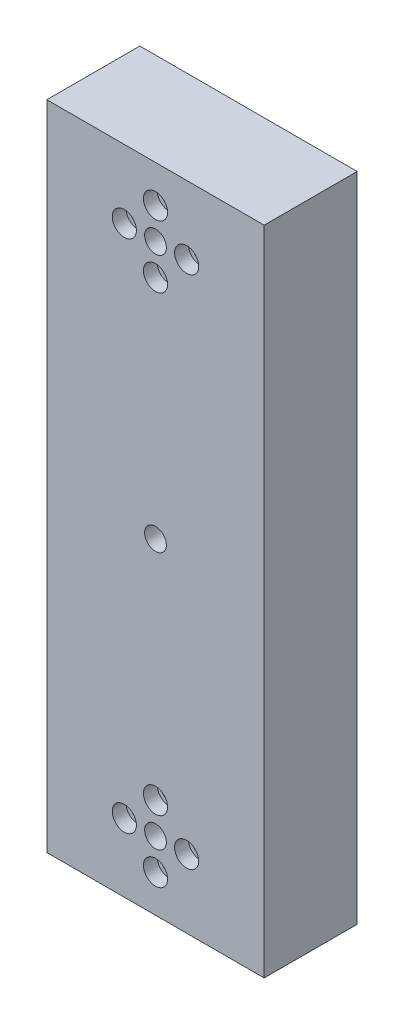
ISO-10303-21;
HEADER;
FILE_DESCRIPTION(('STEP AP214'),'2;1');
FILE_NAME('part.step','',(''),(''),'','','');
FILE_SCHEMA(('AUTOMOTIVE_DESIGN { 1 0 10303 214 1 1 1 1 }'));
ENDSEC;
DATA;
#1=APPLICATION_CONTEXT('core data for automotive mechanical design processes');
#2=APPLICATION_PROTOCOL_DEFINITION('international standard','automotive_design',2000,#1);
#3=PRODUCT_CONTEXT('',#1,'mechanical');
#4=PRODUCT('Part','Part','',(#3));
#5=PRODUCT_RELATED_PRODUCT_CATEGORY('part','',(#4));
#6=PRODUCT_DEFINITION_FORMATION('','',#4);
#7=PRODUCT_DEFINITION_CONTEXT('part definition',#1,'design');
#8=PRODUCT_DEFINITION('design','',#6,#7);
#9=PRODUCT_DEFINITION_SHAPE('','',#8);
#10=(LENGTH_UNIT() NAMED_UNIT(*) SI_UNIT(.MILLI.,.METRE.));
#11=(NAMED_UNIT(*) PLANE_ANGLE_UNIT() SI_UNIT($,.RADIAN.));
#12=(NAMED_UNIT(*) SI_UNIT($,.STERADIAN.) SOLID_ANGLE_UNIT());
#13=UNCERTAINTY_MEASURE_WITH_UNIT(LENGTH_MEASURE(1.E-05),#10,'distance_accuracy_value','');
#14=(GEOMETRIC_REPRESENTATION_CONTEXT(3) GLOBAL_UNCERTAINTY_ASSIGNED_CONTEXT((#13)) GLOBAL_UNIT_ASSIGNED_CONTEXT((#10,
#11,#12)) REPRESENTATION_CONTEXT('',''));
#15=CARTESIAN_POINT('',(0.,0.,0.));
#16=DIRECTION('',(0.,0.,1.));
#17=DIRECTION('',(1.,0.,0.));
#18=AXIS2_PLACEMENT_3D('',#15,#16,#17);
#19=CARTESIAN_POINT('',(0.,0.,0.));
#20=DIRECTION('',(0.,0.,-1.));
#21=DIRECTION('',(-1.,0.,0.));
#22=AXIS2_PLACEMENT_3D('',#19,#20,#21);
#23=PLANE('',#22);
#24=CARTESIAN_POINT('',(14.351,-118.5,0.));
#25=DIRECTION('',(0.,0.,1.));
#26=DIRECTION('',(1.,0.,0.));
#27=AXIS2_PLACEMENT_3D('',#24,#25,#26);
#28=CIRCLE('',#27,5.55625);
#29=CARTESIAN_POINT('',(19.90725,-118.5,0.));
#30=VERTEX_POINT('',#29);
#31=EDGE_CURVE('E388',#30,#30,#28,.T.);
#32=ORIENTED_EDGE('',*,*,#31,.F.);
#33=EDGE_LOOP('',(#32));
#34=FACE_BOUND('',#33,.T.);
#35=CARTESIAN_POINT('',(0.,-132.851,0.));
#36=DIRECTION('',(0.,0.,1.));
#37=DIRECTION('',(1.,0.,0.));
#38=AXIS2_PLACEMENT_3D('',#35,#36,#37);
#39=CIRCLE('',#38,5.55625);
#40=CARTESIAN_POINT('',(5.55625,-132.851,0.));
#41=VERTEX_POINT('',#40);
#42=EDGE_CURVE('E403',#41,#41,#39,.T.);
#43=ORIENTED_EDGE('',*,*,#42,.F.);
#44=EDGE_LOOP('',(#43));
#45=FACE_BOUND('',#44,.T.);
#46=CARTESIAN_POINT('',(-14.351,-118.5,0.));
#47=DIRECTION('',(0.,0.,1.));
#48=DIRECTION('',(1.,0.,0.));
#49=AXIS2_PLACEMENT_3D('',#46,#47,#48);
#50=CIRCLE('',#49,5.55625);
#51=CARTESIAN_POINT('',(-8.79475,-118.5,0.));
#52=VERTEX_POINT('',#51);
#53=EDGE_CURVE('E423',#52,#52,#50,.T.);
#54=ORIENTED_EDGE('',*,*,#53,.F.);
#55=EDGE_LOOP('',(#54));
#56=FACE_BOUND('',#55,.T.);
#57=CARTESIAN_POINT('',(0.,-104.149,0.));
#58=DIRECTION('',(0.,0.,1.));
#59=DIRECTION('',(1.,0.,0.));
#60=AXIS2_PLACEMENT_3D('',#57,#58,#59);
#61=CIRCLE('',#60,5.55625);
#62=CARTESIAN_POINT('',(5.55625,-104.149,0.));
#63=VERTEX_POINT('',#62);
#64=EDGE_CURVE('E440',#63,#63,#61,.T.);
#65=ORIENTED_EDGE('',*,*,#64,.F.);
#66=EDGE_LOOP('',(#65));
#67=FACE_BOUND('',#66,.T.);
#68=CARTESIAN_POINT('',(1.15628617791685E-13,104.149,0.));
#69=DIRECTION('',(0.,0.,1.));
#70=DIRECTION('',(1.,0.,0.));
#71=AXIS2_PLACEMENT_3D('',#68,#69,#70);
#72=CIRCLE('',#71,5.55625);
#73=CARTESIAN_POINT('',(5.55625000000011,104.149,0.));
#74=VERTEX_POINT('',#73);
#75=EDGE_CURVE('E455',#74,#74,#72,.T.);
#76=ORIENTED_EDGE('',*,*,#75,.F.);
#77=EDGE_LOOP('',(#76));
#78=FACE_BOUND('',#77,.T.);
#79=CARTESIAN_POINT('',(14.3510000000001,118.5,0.));
#80=DIRECTION('',(0.,0.,1.));
#81=DIRECTION('',(1.,0.,0.));
#82=AXIS2_PLACEMENT_3D('',#79,#80,#81);
#83=CIRCLE('',#82,5.55625);
#84=CARTESIAN_POINT('',(19.9072500000001,118.5,0.));
#85=VERTEX_POINT('',#84);
#86=EDGE_CURVE('E466',#85,#85,#83,.T.);
#87=ORIENTED_EDGE('',*,*,#86,.F.);
#88=EDGE_LOOP('',(#87));
#89=FACE_BOUND('',#88,.T.);
#90=CARTESIAN_POINT('',(-14.3509999999999,118.5,0.));
#91=DIRECTION('',(0.,0.,1.));
#92=DIRECTION('',(1.,0.,0.));
#93=AXIS2_PLACEMENT_3D('',#90,#91,#92);
#94=CIRCLE('',#93,5.55625);
#95=CARTESIAN_POINT('',(-8.79474999999987,118.5,0.));
#96=VERTEX_POINT('',#95);
#97=EDGE_CURVE('E502',#96,#96,#94,.T.);
#98=ORIENTED_EDGE('',*,*,#97,.F.);
#99=EDGE_LOOP('',(#98));
#100=FACE_BOUND('',#99,.T.);
#101=CARTESIAN_POINT('',(0.,118.5,0.));
#102=DIRECTION('',(0.,0.,1.));
#103=DIRECTION('',(-1.,0.,0.));
#104=AXIS2_PLACEMENT_3D('',#101,#102,#103);
#105=CIRCLE('',#104,5.);
#106=CARTESIAN_POINT('',(-5.,118.5,0.));
#107=VERTEX_POINT('',#106);
#108=EDGE_CURVE('E520',#107,#107,#105,.T.);
#109=ORIENTED_EDGE('',*,*,#108,.F.);
#110=EDGE_LOOP('',(#109));
#111=FACE_BOUND('',#110,.T.);
#112=CARTESIAN_POINT('',(0.,-118.5,0.));
#113=DIRECTION('',(0.,0.,1.));
#114=DIRECTION('',(1.,0.,0.));
#115=AXIS2_PLACEMENT_3D('',#112,#113,#114);
#116=CIRCLE('',#115,5.);
#117=CARTESIAN_POINT('',(5.,-118.5,0.));
#118=VERTEX_POINT('',#117);
#119=EDGE_CURVE('E524',#118,#118,#116,.T.);
#120=ORIENTED_EDGE('',*,*,#119,.F.);
#121=EDGE_LOOP('',(#120));
#122=FACE_BOUND('',#121,.T.);
#123=CARTESIAN_POINT('',(0.,0.,0.));
#124=DIRECTION('',(0.,0.,1.));
#125=DIRECTION('',(1.,0.,0.));
#126=AXIS2_PLACEMENT_3D('',#123,#124,#125);
#127=CIRCLE('',#126,5.);
#128=CARTESIAN_POINT('',(5.,0.,0.));
#129=VERTEX_POINT('',#128);
#130=EDGE_CURVE('E529',#129,#129,#127,.T.);
#131=ORIENTED_EDGE('',*,*,#130,.F.);
#132=EDGE_LOOP('',(#131));
#133=FACE_BOUND('',#132,.T.);
#134=DIRECTION('',(-1.,0.,0.));
#135=VECTOR('',#134,1.);
#136=CARTESIAN_POINT('',(50.,150.,0.));
#137=LINE('',#136,#135);
#138=CARTESIAN_POINT('',(50.,150.,0.));
#139=VERTEX_POINT('',#138);
#140=CARTESIAN_POINT('',(-50.,150.,0.));
#141=VERTEX_POINT('',#140);
#142=EDGE_CURVE('E231',#139,#141,#137,.T.);
#143=ORIENTED_EDGE('',*,*,#142,.T.);
#144=DIRECTION('',(0.,-1.,0.));
#145=VECTOR('',#144,1.);
#146=CARTESIAN_POINT('',(-50.,-150.,0.));
#147=LINE('',#146,#145);
#148=CARTESIAN_POINT('',(-50.,-150.,0.));
#149=VERTEX_POINT('',#148);
#150=EDGE_CURVE('E236',#141,#149,#147,.T.);
#151=ORIENTED_EDGE('',*,*,#150,.T.);
#152=DIRECTION('',(1.,0.,0.));
#153=VECTOR('',#152,1.);
#154=CARTESIAN_POINT('',(50.,-150.,0.));
#155=LINE('',#154,#153);
#156=CARTESIAN_POINT('',(50.,-150.,0.));
#157=VERTEX_POINT('',#156);
#158=EDGE_CURVE('E213',#149,#157,#155,.T.);
#159=ORIENTED_EDGE('',*,*,#158,.T.);
#160=DIRECTION('',(0.,1.,0.));
#161=VECTOR('',#160,1.);
#162=CARTESIAN_POINT('',(50.,-150.,0.));
#163=LINE('',#162,#161);
#164=EDGE_CURVE('E229',#157,#139,#163,.T.);
#165=ORIENTED_EDGE('',*,*,#164,.T.);
#166=EDGE_LOOP('',(#143,#151,#159,#165));
#167=FACE_BOUND('',#166,.T.);
#168=CARTESIAN_POINT('',(1.47494239044477E-13,132.851,0.));
#169=DIRECTION('',(0.,0.,1.));
#170=DIRECTION('',(1.,0.,0.));
#171=AXIS2_PLACEMENT_3D('',#168,#169,#170);
#172=CIRCLE('',#171,5.55625);
#173=CARTESIAN_POINT('',(5.55625000000015,132.851,0.));
#174=VERTEX_POINT('',#173);
#175=EDGE_CURVE('E484',#174,#174,#172,.T.);
#176=ORIENTED_EDGE('',*,*,#175,.F.);
#177=EDGE_LOOP('',(#176));
#178=FACE_BOUND('',#177,.T.);
#179=ADVANCED_FACE('F161',(#34,#45,#56,#67,#78,#89,#100,#111,#122,#133,#167,#178),#23,.F.);
#180=CARTESIAN_POINT('',(50.,150.,-42.8));
#181=DIRECTION('',(0.,1.,0.));
#182=DIRECTION('',(0.,0.,1.));
#183=AXIS2_PLACEMENT_3D('',#180,#181,#182);
#184=PLANE('',#183);
#185=ORIENTED_EDGE('',*,*,#142,.F.);
#186=DIRECTION('',(0.,0.,1.));
#187=VECTOR('',#186,1.);
#188=CARTESIAN_POINT('',(50.,150.,-42.8));
#189=LINE('',#188,#187);
#190=CARTESIAN_POINT('',(50.,150.,-42.8));
#191=VERTEX_POINT('',#190);
#192=EDGE_CURVE('E12',#191,#139,#189,.T.);
#193=ORIENTED_EDGE('',*,*,#192,.F.);
#194=DIRECTION('',(-1.,0.,0.));
#195=VECTOR('',#194,1.);
#196=CARTESIAN_POINT('',(50.,150.,-42.8));
#197=LINE('',#196,#195);
#198=CARTESIAN_POINT('',(-50.,150.,-42.8));
#199=VERTEX_POINT('',#198);
#200=EDGE_CURVE('E221',#191,#199,#197,.T.);
#201=ORIENTED_EDGE('',*,*,#200,.T.);
#202=DIRECTION('',(0.,0.,1.));
#203=VECTOR('',#202,1.);
#204=CARTESIAN_POINT('',(-50.,150.,-42.8));
#205=LINE('',#204,#203);
#206=EDGE_CURVE('E164',#199,#141,#205,.T.);
#207=ORIENTED_EDGE('',*,*,#206,.T.);
#208=EDGE_LOOP('',(#185,#193,#201,#207));
#209=FACE_BOUND('',#208,.T.);
#210=ADVANCED_FACE('F162',(#209),#184,.T.);
#211=CARTESIAN_POINT('',(50.,-150.,-42.8));
#212=DIRECTION('',(1.,0.,0.));
#213=DIRECTION('',(0.,0.,-1.));
#214=AXIS2_PLACEMENT_3D('',#211,#212,#213);
#215=PLANE('',#214);
#216=ORIENTED_EDGE('',*,*,#164,.F.);
#217=DIRECTION('',(0.,0.,1.));
#218=VECTOR('',#217,1.);
#219=CARTESIAN_POINT('',(50.,-150.,-42.8));
#220=LINE('',#219,#218);
#221=CARTESIAN_POINT('',(50.,-150.,-42.8));
#222=VERTEX_POINT('',#221);
#223=EDGE_CURVE('E175',#222,#157,#220,.T.);
#224=ORIENTED_EDGE('',*,*,#223,.F.);
#225=DIRECTION('',(0.,1.,0.));
#226=VECTOR('',#225,1.);
#227=CARTESIAN_POINT('',(50.,-150.,-42.8));
#228=LINE('',#227,#226);
#229=EDGE_CURVE('E218',#222,#191,#228,.T.);
#230=ORIENTED_EDGE('',*,*,#229,.T.);
#231=ORIENTED_EDGE('',*,*,#192,.T.);
#232=EDGE_LOOP('',(#216,#224,#230,#231));
#233=FACE_BOUND('',#232,.T.);
#234=ADVANCED_FACE('F260',(#233),#215,.T.);
#235=CARTESIAN_POINT('',(50.,-150.,-42.8));
#236=DIRECTION('',(0.,-1.,0.));
#237=DIRECTION('',(0.,0.,-1.));
#238=AXIS2_PLACEMENT_3D('',#235,#236,#237);
#239=PLANE('',#238);
#240=ORIENTED_EDGE('',*,*,#158,.F.);
#241=DIRECTION('',(0.,0.,1.));
#242=VECTOR('',#241,1.);
#243=CARTESIAN_POINT('',(-50.,-150.,-42.8));
#244=LINE('',#243,#242);
#245=CARTESIAN_POINT('',(-50.,-150.,-42.8));
#246=VERTEX_POINT('',#245);
#247=EDGE_CURVE('E208',#246,#149,#244,.T.);
#248=ORIENTED_EDGE('',*,*,#247,.F.);
#249=DIRECTION('',(1.,0.,0.));
#250=VECTOR('',#249,1.);
#251=CARTESIAN_POINT('',(50.,-150.,-42.8));
#252=LINE('',#251,#250);
#253=EDGE_CURVE('E211',#246,#222,#252,.T.);
#254=ORIENTED_EDGE('',*,*,#253,.T.);
#255=ORIENTED_EDGE('',*,*,#223,.T.);
#256=EDGE_LOOP('',(#240,#248,#254,#255));
#257=FACE_BOUND('',#256,.T.);
#258=ADVANCED_FACE('F209',(#257),#239,.T.);
#259=CARTESIAN_POINT('',(-50.,-150.,-42.8));
#260=DIRECTION('',(-1.,0.,0.));
#261=DIRECTION('',(0.,0.,1.));
#262=AXIS2_PLACEMENT_3D('',#259,#260,#261);
#263=PLANE('',#262);
#264=ORIENTED_EDGE('',*,*,#150,.F.);
#265=ORIENTED_EDGE('',*,*,#206,.F.);
#266=DIRECTION('',(0.,-1.,0.));
#267=VECTOR('',#266,1.);
#268=CARTESIAN_POINT('',(-50.,-150.,-42.8));
#269=LINE('',#268,#267);
#270=EDGE_CURVE('E217',#199,#246,#269,.T.);
#271=ORIENTED_EDGE('',*,*,#270,.T.);
#272=ORIENTED_EDGE('',*,*,#247,.T.);
#273=EDGE_LOOP('',(#264,#265,#271,#272));
#274=FACE_BOUND('',#273,.T.);
#275=ADVANCED_FACE('F225',(#274),#263,.T.);
#276=CARTESIAN_POINT('',(0.,0.,-42.8));
#277=DIRECTION('',(0.,0.,-1.));
#278=DIRECTION('',(-1.,0.,0.));
#279=AXIS2_PLACEMENT_3D('',#276,#277,#278);
#280=PLANE('',#279);
#281=CARTESIAN_POINT('',(14.351,-118.5,-42.8));
#282=DIRECTION('',(0.,0.,1.));
#283=DIRECTION('',(1.,0.,0.));
#284=AXIS2_PLACEMENT_3D('',#281,#282,#283);
#285=CIRCLE('',#284,3.56869999999999);
#286=CARTESIAN_POINT('',(17.9197,-118.5,-42.8));
#287=VERTEX_POINT('',#286);
#288=EDGE_CURVE('E402',#287,#287,#285,.T.);
#289=ORIENTED_EDGE('',*,*,#288,.T.);
#290=EDGE_LOOP('',(#289));
#291=FACE_BOUND('',#290,.T.);
#292=CARTESIAN_POINT('',(0.,-132.851,-42.8));
#293=DIRECTION('',(0.,0.,1.));
#294=DIRECTION('',(1.,0.,0.));
#295=AXIS2_PLACEMENT_3D('',#292,#293,#294);
#296=CIRCLE('',#295,3.56869999999999);
#297=CARTESIAN_POINT('',(3.56869999999999,-132.851,-42.8));
#298=VERTEX_POINT('',#297);
#299=EDGE_CURVE('E417',#298,#298,#296,.T.);
#300=ORIENTED_EDGE('',*,*,#299,.T.);
#301=EDGE_LOOP('',(#300));
#302=FACE_BOUND('',#301,.T.);
#303=CARTESIAN_POINT('',(-14.351,-118.5,-42.8));
#304=DIRECTION('',(0.,0.,1.));
#305=DIRECTION('',(1.,0.,0.));
#306=AXIS2_PLACEMENT_3D('',#303,#304,#305);
#307=CIRCLE('',#306,3.56869999999999);
#308=CARTESIAN_POINT('',(-10.7823,-118.5,-42.8));
#309=VERTEX_POINT('',#308);
#310=EDGE_CURVE('E433',#309,#309,#307,.T.);
#311=ORIENTED_EDGE('',*,*,#310,.T.);
#312=EDGE_LOOP('',(#311));
#313=FACE_BOUND('',#312,.T.);
#314=CARTESIAN_POINT('',(0.,-104.149,-42.8));
#315=DIRECTION('',(0.,0.,1.));
#316=DIRECTION('',(1.,0.,0.));
#317=AXIS2_PLACEMENT_3D('',#314,#315,#316);
#318=CIRCLE('',#317,3.56869999999999);
#319=CARTESIAN_POINT('',(3.56869999999999,-104.149,-42.8));
#320=VERTEX_POINT('',#319);
#321=EDGE_CURVE('E446',#320,#320,#318,.T.);
#322=ORIENTED_EDGE('',*,*,#321,.T.);
#323=EDGE_LOOP('',(#322));
#324=FACE_BOUND('',#323,.T.);
#325=CARTESIAN_POINT('',(1.15628617791685E-13,104.149,-42.8));
#326=DIRECTION('',(0.,0.,1.));
#327=DIRECTION('',(1.,0.,0.));
#328=AXIS2_PLACEMENT_3D('',#325,#326,#327);
#329=CIRCLE('',#328,3.56869999999999);
#330=CARTESIAN_POINT('',(3.56870000000011,104.149,-42.8));
#331=VERTEX_POINT('',#330);
#332=EDGE_CURVE('E463',#331,#331,#329,.T.);
#333=ORIENTED_EDGE('',*,*,#332,.T.);
#334=EDGE_LOOP('',(#333));
#335=FACE_BOUND('',#334,.T.);
#336=CARTESIAN_POINT('',(14.3510000000001,118.5,-42.8));
#337=DIRECTION('',(0.,0.,1.));
#338=DIRECTION('',(1.,0.,0.));
#339=AXIS2_PLACEMENT_3D('',#336,#337,#338);
#340=CIRCLE('',#339,3.56869999999999);
#341=CARTESIAN_POINT('',(17.9197000000001,118.5,-42.8));
#342=VERTEX_POINT('',#341);
#343=EDGE_CURVE('E481',#342,#342,#340,.T.);
#344=ORIENTED_EDGE('',*,*,#343,.T.);
#345=EDGE_LOOP('',(#344));
#346=FACE_BOUND('',#345,.T.);
#347=CARTESIAN_POINT('',(1.47494239044477E-13,132.851,-42.8));
#348=DIRECTION('',(0.,0.,1.));
#349=DIRECTION('',(1.,0.,0.));
#350=AXIS2_PLACEMENT_3D('',#347,#348,#349);
#351=CIRCLE('',#350,3.56869999999999);
#352=CARTESIAN_POINT('',(3.56870000000014,132.851,-42.8));
#353=VERTEX_POINT('',#352);
#354=EDGE_CURVE('E500',#353,#353,#351,.T.);
#355=ORIENTED_EDGE('',*,*,#354,.T.);
#356=EDGE_LOOP('',(#355));
#357=FACE_BOUND('',#356,.T.);
#358=CARTESIAN_POINT('',(-14.3509999999999,118.5,-42.8));
#359=DIRECTION('',(0.,0.,1.));
#360=DIRECTION('',(1.,0.,0.));
#361=AXIS2_PLACEMENT_3D('',#358,#359,#360);
#362=CIRCLE('',#361,3.56869999999999);
#363=CARTESIAN_POINT('',(-10.7822999999999,118.5,-42.8));
#364=VERTEX_POINT('',#363);
#365=EDGE_CURVE('E511',#364,#364,#362,.T.);
#366=ORIENTED_EDGE('',*,*,#365,.T.);
#367=EDGE_LOOP('',(#366));
#368=FACE_BOUND('',#367,.T.);
#369=CARTESIAN_POINT('',(0.,118.5,-42.8));
#370=DIRECTION('',(0.,0.,1.));
#371=DIRECTION('',(-1.,0.,0.));
#372=AXIS2_PLACEMENT_3D('',#369,#370,#371);
#373=CIRCLE('',#372,5.);
#374=CARTESIAN_POINT('',(-5.,118.5,-42.8));
#375=VERTEX_POINT('',#374);
#376=EDGE_CURVE('E519',#375,#375,#373,.T.);
#377=ORIENTED_EDGE('',*,*,#376,.T.);
#378=EDGE_LOOP('',(#377));
#379=FACE_BOUND('',#378,.T.);
#380=CARTESIAN_POINT('',(0.,-118.5,-42.8));
#381=DIRECTION('',(0.,0.,1.));
#382=DIRECTION('',(1.,0.,0.));
#383=AXIS2_PLACEMENT_3D('',#380,#381,#382);
#384=CIRCLE('',#383,5.);
#385=CARTESIAN_POINT('',(5.,-118.5,-42.8));
#386=VERTEX_POINT('',#385);
#387=EDGE_CURVE('E528',#386,#386,#384,.T.);
#388=ORIENTED_EDGE('',*,*,#387,.T.);
#389=EDGE_LOOP('',(#388));
#390=FACE_BOUND('',#389,.T.);
#391=CARTESIAN_POINT('',(0.,0.,-42.8));
#392=DIRECTION('',(0.,0.,1.));
#393=DIRECTION('',(1.,0.,0.));
#394=AXIS2_PLACEMENT_3D('',#391,#392,#393);
#395=CIRCLE('',#394,5.);
#396=CARTESIAN_POINT('',(5.,0.,-42.8));
#397=VERTEX_POINT('',#396);
#398=EDGE_CURVE('E239',#397,#397,#395,.T.);
#399=ORIENTED_EDGE('',*,*,#398,.T.);
#400=EDGE_LOOP('',(#399));
#401=FACE_BOUND('',#400,.T.);
#402=ORIENTED_EDGE('',*,*,#200,.F.);
#403=ORIENTED_EDGE('',*,*,#229,.F.);
#404=ORIENTED_EDGE('',*,*,#253,.F.);
#405=ORIENTED_EDGE('',*,*,#270,.F.);
#406=EDGE_LOOP('',(#402,#403,#404,#405));
#407=FACE_BOUND('',#406,.T.);
#408=ADVANCED_FACE('F220',(#291,#302,#313,#324,#335,#346,#357,#368,#379,#390,#401,#407),#280,.T.);
#409=CARTESIAN_POINT('',(0.,0.,-42.8));
#410=DIRECTION('',(0.,0.,1.));
#411=DIRECTION('',(1.,0.,0.));
#412=AXIS2_PLACEMENT_3D('',#409,#410,#411);
#413=CYLINDRICAL_SURFACE('',#412,5.);
#414=ORIENTED_EDGE('',*,*,#398,.F.);
#415=EDGE_LOOP('',(#414));
#416=FACE_BOUND('',#415,.T.);
#417=ORIENTED_EDGE('',*,*,#130,.T.);
#418=EDGE_LOOP('',(#417));
#419=FACE_BOUND('',#418,.T.);
#420=ADVANCED_FACE('F277',(#416,#419),#413,.F.);
#421=CARTESIAN_POINT('',(0.,-118.5,-42.8));
#422=DIRECTION('',(0.,0.,1.));
#423=DIRECTION('',(1.,0.,0.));
#424=AXIS2_PLACEMENT_3D('',#421,#422,#423);
#425=CYLINDRICAL_SURFACE('',#424,5.);
#426=ORIENTED_EDGE('',*,*,#387,.F.);
#427=EDGE_LOOP('',(#426));
#428=FACE_BOUND('',#427,.T.);
#429=ORIENTED_EDGE('',*,*,#119,.T.);
#430=EDGE_LOOP('',(#429));
#431=FACE_BOUND('',#430,.T.);
#432=ADVANCED_FACE('F278',(#428,#431),#425,.F.);
#433=CARTESIAN_POINT('',(0.,118.5,-42.8));
#434=DIRECTION('',(0.,0.,1.));
#435=DIRECTION('',(1.,0.,0.));
#436=AXIS2_PLACEMENT_3D('',#433,#434,#435);
#437=CYLINDRICAL_SURFACE('',#436,5.);
#438=ORIENTED_EDGE('',*,*,#376,.F.);
#439=EDGE_LOOP('',(#438));
#440=FACE_BOUND('',#439,.T.);
#441=ORIENTED_EDGE('',*,*,#108,.T.);
#442=EDGE_LOOP('',(#441));
#443=FACE_BOUND('',#442,.T.);
#444=ADVANCED_FACE('F281',(#440,#443),#437,.F.);
#445=CARTESIAN_POINT('',(-14.3509999999999,118.5,0.));
#446=DIRECTION('',(0.,0.,1.));
#447=DIRECTION('',(1.,0.,0.));
#448=AXIS2_PLACEMENT_3D('',#445,#446,#447);
#449=CYLINDRICAL_SURFACE('',#448,3.5687);
#450=ORIENTED_EDGE('',*,*,#365,.F.);
#451=EDGE_LOOP('',(#450));
#452=FACE_BOUND('',#451,.T.);
#453=CARTESIAN_POINT('',(-14.3509999999999,118.5,-6.35));
#454=DIRECTION('',(0.,0.,1.));
#455=DIRECTION('',(1.,0.,0.));
#456=AXIS2_PLACEMENT_3D('',#453,#454,#455);
#457=CIRCLE('',#456,3.5687);
#458=CARTESIAN_POINT('',(-10.7822999999999,118.5,-6.35));
#459=VERTEX_POINT('',#458);
#460=EDGE_CURVE('E506',#459,#459,#457,.T.);
#461=ORIENTED_EDGE('',*,*,#460,.T.);
#462=EDGE_LOOP('',(#461));
#463=FACE_BOUND('',#462,.T.);
#464=ADVANCED_FACE('F289',(#452,#463),#449,.F.);
#465=CARTESIAN_POINT('',(-10.7822999999999,118.5,-6.35));
#466=DIRECTION('',(0.,0.,-1.));
#467=DIRECTION('',(-1.,0.,0.));
#468=AXIS2_PLACEMENT_3D('',#465,#466,#467);
#469=PLANE('',#468);
#470=ORIENTED_EDGE('',*,*,#460,.F.);
#471=EDGE_LOOP('',(#470));
#472=FACE_BOUND('',#471,.T.);
#473=CARTESIAN_POINT('',(-14.3509999999999,118.5,-6.35));
#474=DIRECTION('',(0.,0.,1.));
#475=DIRECTION('',(1.,0.,0.));
#476=AXIS2_PLACEMENT_3D('',#473,#474,#475);
#477=CIRCLE('',#476,5.55625);
#478=CARTESIAN_POINT('',(-8.79474999999987,118.5,-6.35));
#479=VERTEX_POINT('',#478);
#480=EDGE_CURVE('E503',#479,#479,#477,.T.);
#481=ORIENTED_EDGE('',*,*,#480,.T.);
#482=EDGE_LOOP('',(#481));
#483=FACE_BOUND('',#482,.T.);
#484=ADVANCED_FACE('F292',(#472,#483),#469,.F.);
#485=CARTESIAN_POINT('',(-14.3509999999999,118.5,0.));
#486=DIRECTION('',(0.,0.,1.));
#487=DIRECTION('',(1.,0.,0.));
#488=AXIS2_PLACEMENT_3D('',#485,#486,#487);
#489=CYLINDRICAL_SURFACE('',#488,5.55625);
#490=ORIENTED_EDGE('',*,*,#480,.F.);
#491=EDGE_LOOP('',(#490));
#492=FACE_BOUND('',#491,.T.);
#493=ORIENTED_EDGE('',*,*,#97,.T.);
#494=EDGE_LOOP('',(#493));
#495=FACE_BOUND('',#494,.T.);
#496=ADVANCED_FACE('F293',(#492,#495),#489,.F.);
#497=CARTESIAN_POINT('',(1.47494239044477E-13,132.851,0.));
#498=DIRECTION('',(0.,0.,1.));
#499=DIRECTION('',(1.,0.,0.));
#500=AXIS2_PLACEMENT_3D('',#497,#498,#499);
#501=CYLINDRICAL_SURFACE('',#500,3.5687);
#502=ORIENTED_EDGE('',*,*,#354,.F.);
#503=EDGE_LOOP('',(#502));
#504=FACE_BOUND('',#503,.T.);
#505=CARTESIAN_POINT('',(1.47494239044477E-13,132.851,-6.35));
#506=DIRECTION('',(0.,0.,1.));
#507=DIRECTION('',(1.,0.,0.));
#508=AXIS2_PLACEMENT_3D('',#505,#506,#507);
#509=CIRCLE('',#508,3.5687);
#510=CARTESIAN_POINT('',(3.56870000000015,132.851,-6.35));
#511=VERTEX_POINT('',#510);
#512=EDGE_CURVE('E492',#511,#511,#509,.T.);
#513=ORIENTED_EDGE('',*,*,#512,.T.);
#514=EDGE_LOOP('',(#513));
#515=FACE_BOUND('',#514,.T.);
#516=ADVANCED_FACE('F296',(#504,#515),#501,.F.);
#517=CARTESIAN_POINT('',(3.56870000000015,132.851,-6.35));
#518=DIRECTION('',(0.,0.,-1.));
#519=DIRECTION('',(-1.,0.,0.));
#520=AXIS2_PLACEMENT_3D('',#517,#518,#519);
#521=PLANE('',#520);
#522=ORIENTED_EDGE('',*,*,#512,.F.);
#523=EDGE_LOOP('',(#522));
#524=FACE_BOUND('',#523,.T.);
#525=CARTESIAN_POINT('',(1.47494239044477E-13,132.851,-6.35));
#526=DIRECTION('',(0.,0.,1.));
#527=DIRECTION('',(1.,0.,0.));
#528=AXIS2_PLACEMENT_3D('',#525,#526,#527);
#529=CIRCLE('',#528,5.55625);
#530=CARTESIAN_POINT('',(5.55625000000015,132.851,-6.35));
#531=VERTEX_POINT('',#530);
#532=EDGE_CURVE('E487',#531,#531,#529,.T.);
#533=ORIENTED_EDGE('',*,*,#532,.T.);
#534=EDGE_LOOP('',(#533));
#535=FACE_BOUND('',#534,.T.);
#536=ADVANCED_FACE('F305',(#524,#535),#521,.F.);
#537=CARTESIAN_POINT('',(1.47494239044477E-13,132.851,0.));
#538=DIRECTION('',(0.,0.,1.));
#539=DIRECTION('',(1.,0.,0.));
#540=AXIS2_PLACEMENT_3D('',#537,#538,#539);
#541=CYLINDRICAL_SURFACE('',#540,5.55625);
#542=ORIENTED_EDGE('',*,*,#532,.F.);
#543=EDGE_LOOP('',(#542));
#544=FACE_BOUND('',#543,.T.);
#545=ORIENTED_EDGE('',*,*,#175,.T.);
#546=EDGE_LOOP('',(#545));
#547=FACE_BOUND('',#546,.T.);
#548=ADVANCED_FACE('F307',(#544,#547),#541,.F.);
#549=CARTESIAN_POINT('',(14.3510000000001,118.5,0.));
#550=DIRECTION('',(0.,0.,1.));
#551=DIRECTION('',(1.,0.,0.));
#552=AXIS2_PLACEMENT_3D('',#549,#550,#551);
#553=CYLINDRICAL_SURFACE('',#552,3.5687);
#554=ORIENTED_EDGE('',*,*,#343,.F.);
#555=EDGE_LOOP('',(#554));
#556=FACE_BOUND('',#555,.T.);
#557=CARTESIAN_POINT('',(14.3510000000001,118.5,-6.35));
#558=DIRECTION('',(0.,0.,1.));
#559=DIRECTION('',(1.,0.,0.));
#560=AXIS2_PLACEMENT_3D('',#557,#558,#559);
#561=CIRCLE('',#560,3.5687);
#562=CARTESIAN_POINT('',(17.9197000000001,118.5,-6.35));
#563=VERTEX_POINT('',#562);
#564=EDGE_CURVE('E480',#563,#563,#561,.T.);
#565=ORIENTED_EDGE('',*,*,#564,.T.);
#566=EDGE_LOOP('',(#565));
#567=FACE_BOUND('',#566,.T.);
#568=ADVANCED_FACE('F313',(#556,#567),#553,.F.);
#569=CARTESIAN_POINT('',(17.9197000000001,118.5,-6.35));
#570=DIRECTION('',(0.,0.,-1.));
#571=DIRECTION('',(-1.,0.,0.));
#572=AXIS2_PLACEMENT_3D('',#569,#570,#571);
#573=PLANE('',#572);
#574=ORIENTED_EDGE('',*,*,#564,.F.);
#575=EDGE_LOOP('',(#574));
#576=FACE_BOUND('',#575,.T.);
#577=CARTESIAN_POINT('',(14.3510000000001,118.5,-6.35));
#578=DIRECTION('',(0.,0.,1.));
#579=DIRECTION('',(1.,0.,0.));
#580=AXIS2_PLACEMENT_3D('',#577,#578,#579);
#581=CIRCLE('',#580,5.55625);
#582=CARTESIAN_POINT('',(19.9072500000001,118.5,-6.35));
#583=VERTEX_POINT('',#582);
#584=EDGE_CURVE('E471',#583,#583,#581,.T.);
#585=ORIENTED_EDGE('',*,*,#584,.T.);
#586=EDGE_LOOP('',(#585));
#587=FACE_BOUND('',#586,.T.);
#588=ADVANCED_FACE('F312',(#576,#587),#573,.F.);
#589=CARTESIAN_POINT('',(14.3510000000001,118.5,0.));
#590=DIRECTION('',(0.,0.,1.));
#591=DIRECTION('',(1.,0.,0.));
#592=AXIS2_PLACEMENT_3D('',#589,#590,#591);
#593=CYLINDRICAL_SURFACE('',#592,5.55625);
#594=ORIENTED_EDGE('',*,*,#584,.F.);
#595=EDGE_LOOP('',(#594));
#596=FACE_BOUND('',#595,.T.);
#597=ORIENTED_EDGE('',*,*,#86,.T.);
#598=EDGE_LOOP('',(#597));
#599=FACE_BOUND('',#598,.T.);
#600=ADVANCED_FACE('F317',(#596,#599),#593,.F.);
#601=CARTESIAN_POINT('',(1.15628617791685E-13,104.149,0.));
#602=DIRECTION('',(0.,0.,1.));
#603=DIRECTION('',(1.,0.,0.));
#604=AXIS2_PLACEMENT_3D('',#601,#602,#603);
#605=CYLINDRICAL_SURFACE('',#604,3.5687);
#606=ORIENTED_EDGE('',*,*,#332,.F.);
#607=EDGE_LOOP('',(#606));
#608=FACE_BOUND('',#607,.T.);
#609=CARTESIAN_POINT('',(1.15628617791685E-13,104.149,-6.35));
#610=DIRECTION('',(0.,0.,1.));
#611=DIRECTION('',(1.,0.,0.));
#612=AXIS2_PLACEMENT_3D('',#609,#610,#611);
#613=CIRCLE('',#612,3.5687);
#614=CARTESIAN_POINT('',(3.56870000000012,104.149,-6.35));
#615=VERTEX_POINT('',#614);
#616=EDGE_CURVE('E462',#615,#615,#613,.T.);
#617=ORIENTED_EDGE('',*,*,#616,.T.);
#618=EDGE_LOOP('',(#617));
#619=FACE_BOUND('',#618,.T.);
#620=ADVANCED_FACE('F323',(#608,#619),#605,.F.);
#621=CARTESIAN_POINT('',(3.56870000000012,104.149,-6.35));
#622=DIRECTION('',(0.,0.,-1.));
#623=DIRECTION('',(-1.,0.,0.));
#624=AXIS2_PLACEMENT_3D('',#621,#622,#623);
#625=PLANE('',#624);
#626=ORIENTED_EDGE('',*,*,#616,.F.);
#627=EDGE_LOOP('',(#626));
#628=FACE_BOUND('',#627,.T.);
#629=CARTESIAN_POINT('',(1.15628617791685E-13,104.149,-6.35));
#630=DIRECTION('',(0.,0.,1.));
#631=DIRECTION('',(1.,0.,0.));
#632=AXIS2_PLACEMENT_3D('',#629,#630,#631);
#633=CIRCLE('',#632,5.55625);
#634=CARTESIAN_POINT('',(5.55625000000011,104.149,-6.35));
#635=VERTEX_POINT('',#634);
#636=EDGE_CURVE('E460',#635,#635,#633,.T.);
#637=ORIENTED_EDGE('',*,*,#636,.T.);
#638=EDGE_LOOP('',(#637));
#639=FACE_BOUND('',#638,.T.);
#640=ADVANCED_FACE('F330',(#628,#639),#625,.F.);
#641=CARTESIAN_POINT('',(1.15628617791685E-13,104.149,0.));
#642=DIRECTION('',(0.,0.,1.));
#643=DIRECTION('',(1.,0.,0.));
#644=AXIS2_PLACEMENT_3D('',#641,#642,#643);
#645=CYLINDRICAL_SURFACE('',#644,5.55625);
#646=ORIENTED_EDGE('',*,*,#636,.F.);
#647=EDGE_LOOP('',(#646));
#648=FACE_BOUND('',#647,.T.);
#649=ORIENTED_EDGE('',*,*,#75,.T.);
#650=EDGE_LOOP('',(#649));
#651=FACE_BOUND('',#650,.T.);
#652=ADVANCED_FACE('F332',(#648,#651),#645,.F.);
#653=CARTESIAN_POINT('',(0.,-104.149,0.));
#654=DIRECTION('',(0.,0.,1.));
#655=DIRECTION('',(1.,0.,0.));
#656=AXIS2_PLACEMENT_3D('',#653,#654,#655);
#657=CYLINDRICAL_SURFACE('',#656,3.5687);
#658=ORIENTED_EDGE('',*,*,#321,.F.);
#659=EDGE_LOOP('',(#658));
#660=FACE_BOUND('',#659,.T.);
#661=CARTESIAN_POINT('',(0.,-104.149,-6.35));
#662=DIRECTION('',(0.,0.,1.));
#663=DIRECTION('',(1.,0.,0.));
#664=AXIS2_PLACEMENT_3D('',#661,#662,#663);
#665=CIRCLE('',#664,3.5687);
#666=CARTESIAN_POINT('',(3.5687,-104.149,-6.35));
#667=VERTEX_POINT('',#666);
#668=EDGE_CURVE('E443',#667,#667,#665,.T.);
#669=ORIENTED_EDGE('',*,*,#668,.T.);
#670=EDGE_LOOP('',(#669));
#671=FACE_BOUND('',#670,.T.);
#672=ADVANCED_FACE('F333',(#660,#671),#657,.F.);
#673=CARTESIAN_POINT('',(3.5687,-104.149,-6.35));
#674=DIRECTION('',(0.,0.,-1.));
#675=DIRECTION('',(-1.,0.,0.));
#676=AXIS2_PLACEMENT_3D('',#673,#674,#675);
#677=PLANE('',#676);
#678=ORIENTED_EDGE('',*,*,#668,.F.);
#679=EDGE_LOOP('',(#678));
#680=FACE_BOUND('',#679,.T.);
#681=CARTESIAN_POINT('',(0.,-104.149,-6.35));
#682=DIRECTION('',(0.,0.,1.));
#683=DIRECTION('',(1.,0.,0.));
#684=AXIS2_PLACEMENT_3D('',#681,#682,#683);
#685=CIRCLE('',#684,5.55625);
#686=CARTESIAN_POINT('',(5.55625,-104.149,-6.35));
#687=VERTEX_POINT('',#686);
#688=EDGE_CURVE('E442',#687,#687,#685,.T.);
#689=ORIENTED_EDGE('',*,*,#688,.T.);
#690=EDGE_LOOP('',(#689));
#691=FACE_BOUND('',#690,.T.);
#692=ADVANCED_FACE('F336',(#680,#691),#677,.F.);
#693=CARTESIAN_POINT('',(0.,-104.149,0.));
#694=DIRECTION('',(0.,0.,1.));
#695=DIRECTION('',(1.,0.,0.));
#696=AXIS2_PLACEMENT_3D('',#693,#694,#695);
#697=CYLINDRICAL_SURFACE('',#696,5.55625);
#698=ORIENTED_EDGE('',*,*,#688,.F.);
#699=EDGE_LOOP('',(#698));
#700=FACE_BOUND('',#699,.T.);
#701=ORIENTED_EDGE('',*,*,#64,.T.);
#702=EDGE_LOOP('',(#701));
#703=FACE_BOUND('',#702,.T.);
#704=ADVANCED_FACE('F345',(#700,#703),#697,.F.);
#705=CARTESIAN_POINT('',(-14.351,-118.5,0.));
#706=DIRECTION('',(0.,0.,1.));
#707=DIRECTION('',(1.,0.,0.));
#708=AXIS2_PLACEMENT_3D('',#705,#706,#707);
#709=CYLINDRICAL_SURFACE('',#708,3.5687);
#710=ORIENTED_EDGE('',*,*,#310,.F.);
#711=EDGE_LOOP('',(#710));
#712=FACE_BOUND('',#711,.T.);
#713=CARTESIAN_POINT('',(-14.351,-118.5,-6.35));
#714=DIRECTION('',(0.,0.,1.));
#715=DIRECTION('',(1.,0.,0.));
#716=AXIS2_PLACEMENT_3D('',#713,#714,#715);
#717=CIRCLE('',#716,3.5687);
#718=CARTESIAN_POINT('',(-10.7823,-118.5,-6.35));
#719=VERTEX_POINT('',#718);
#720=EDGE_CURVE('E427',#719,#719,#717,.T.);
#721=ORIENTED_EDGE('',*,*,#720,.T.);
#722=EDGE_LOOP('',(#721));
#723=FACE_BOUND('',#722,.T.);
#724=ADVANCED_FACE('F350',(#712,#723),#709,.F.);
#725=CARTESIAN_POINT('',(-10.7823,-118.5,-6.35));
#726=DIRECTION('',(0.,0.,-1.));
#727=DIRECTION('',(-1.,0.,0.));
#728=AXIS2_PLACEMENT_3D('',#725,#726,#727);
#729=PLANE('',#728);
#730=ORIENTED_EDGE('',*,*,#720,.F.);
#731=EDGE_LOOP('',(#730));
#732=FACE_BOUND('',#731,.T.);
#733=CARTESIAN_POINT('',(-14.351,-118.5,-6.35));
#734=DIRECTION('',(0.,0.,1.));
#735=DIRECTION('',(1.,0.,0.));
#736=AXIS2_PLACEMENT_3D('',#733,#734,#735);
#737=CIRCLE('',#736,5.55625);
#738=CARTESIAN_POINT('',(-8.79475,-118.5,-6.35));
#739=VERTEX_POINT('',#738);
#740=EDGE_CURVE('E422',#739,#739,#737,.T.);
#741=ORIENTED_EDGE('',*,*,#740,.T.);
#742=EDGE_LOOP('',(#741));
#743=FACE_BOUND('',#742,.T.);
#744=ADVANCED_FACE('F352',(#732,#743),#729,.F.);
#745=CARTESIAN_POINT('',(-14.351,-118.5,0.));
#746=DIRECTION('',(0.,0.,1.));
#747=DIRECTION('',(1.,0.,0.));
#748=AXIS2_PLACEMENT_3D('',#745,#746,#747);
#749=CYLINDRICAL_SURFACE('',#748,5.55625);
#750=ORIENTED_EDGE('',*,*,#740,.F.);
#751=EDGE_LOOP('',(#750));
#752=FACE_BOUND('',#751,.T.);
#753=ORIENTED_EDGE('',*,*,#53,.T.);
#754=EDGE_LOOP('',(#753));
#755=FACE_BOUND('',#754,.T.);
#756=ADVANCED_FACE('F353',(#752,#755),#749,.F.);
#757=CARTESIAN_POINT('',(0.,-132.851,0.));
#758=DIRECTION('',(0.,0.,1.));
#759=DIRECTION('',(1.,0.,0.));
#760=AXIS2_PLACEMENT_3D('',#757,#758,#759);
#761=CYLINDRICAL_SURFACE('',#760,3.5687);
#762=ORIENTED_EDGE('',*,*,#299,.F.);
#763=EDGE_LOOP('',(#762));
#764=FACE_BOUND('',#763,.T.);
#765=CARTESIAN_POINT('',(0.,-132.851,-6.35));
#766=DIRECTION('',(0.,0.,1.));
#767=DIRECTION('',(1.,0.,0.));
#768=AXIS2_PLACEMENT_3D('',#765,#766,#767);
#769=CIRCLE('',#768,3.5687);
#770=CARTESIAN_POINT('',(3.5687,-132.851,-6.35));
#771=VERTEX_POINT('',#770);
#772=EDGE_CURVE('E415',#771,#771,#769,.T.);
#773=ORIENTED_EDGE('',*,*,#772,.T.);
#774=EDGE_LOOP('',(#773));
#775=FACE_BOUND('',#774,.T.);
#776=ADVANCED_FACE('F356',(#764,#775),#761,.F.);
#777=CARTESIAN_POINT('',(3.5687,-132.851,-6.35));
#778=DIRECTION('',(0.,0.,-1.));
#779=DIRECTION('',(-1.,0.,0.));
#780=AXIS2_PLACEMENT_3D('',#777,#778,#779);
#781=PLANE('',#780);
#782=ORIENTED_EDGE('',*,*,#772,.F.);
#783=EDGE_LOOP('',(#782));
#784=FACE_BOUND('',#783,.T.);
#785=CARTESIAN_POINT('',(0.,-132.851,-6.35));
#786=DIRECTION('',(0.,0.,1.));
#787=DIRECTION('',(1.,0.,0.));
#788=AXIS2_PLACEMENT_3D('',#785,#786,#787);
#789=CIRCLE('',#788,5.55625);
#790=CARTESIAN_POINT('',(5.55625,-132.851,-6.35));
#791=VERTEX_POINT('',#790);
#792=EDGE_CURVE('E406',#791,#791,#789,.T.);
#793=ORIENTED_EDGE('',*,*,#792,.T.);
#794=EDGE_LOOP('',(#793));
#795=FACE_BOUND('',#794,.T.);
#796=ADVANCED_FACE('F361',(#784,#795),#781,.F.);
#797=CARTESIAN_POINT('',(0.,-132.851,0.));
#798=DIRECTION('',(0.,0.,1.));
#799=DIRECTION('',(1.,0.,0.));
#800=AXIS2_PLACEMENT_3D('',#797,#798,#799);
#801=CYLINDRICAL_SURFACE('',#800,5.55625);
#802=ORIENTED_EDGE('',*,*,#792,.F.);
#803=EDGE_LOOP('',(#802));
#804=FACE_BOUND('',#803,.T.);
#805=ORIENTED_EDGE('',*,*,#42,.T.);
#806=EDGE_LOOP('',(#805));
#807=FACE_BOUND('',#806,.T.);
#808=ADVANCED_FACE('F370',(#804,#807),#801,.F.);
#809=CARTESIAN_POINT('',(14.351,-118.5,0.));
#810=DIRECTION('',(0.,0.,1.));
#811=DIRECTION('',(1.,0.,0.));
#812=AXIS2_PLACEMENT_3D('',#809,#810,#811);
#813=CYLINDRICAL_SURFACE('',#812,3.5687);
#814=ORIENTED_EDGE('',*,*,#288,.F.);
#815=EDGE_LOOP('',(#814));
#816=FACE_BOUND('',#815,.T.);
#817=CARTESIAN_POINT('',(14.351,-118.5,-6.35));
#818=DIRECTION('',(0.,0.,1.));
#819=DIRECTION('',(1.,0.,0.));
#820=AXIS2_PLACEMENT_3D('',#817,#818,#819);
#821=CIRCLE('',#820,3.5687);
#822=CARTESIAN_POINT('',(17.9197,-118.5,-6.35));
#823=VERTEX_POINT('',#822);
#824=EDGE_CURVE('E393',#823,#823,#821,.T.);
#825=ORIENTED_EDGE('',*,*,#824,.T.);
#826=EDGE_LOOP('',(#825));
#827=FACE_BOUND('',#826,.T.);
#828=ADVANCED_FACE('F371',(#816,#827),#813,.F.);
#829=CARTESIAN_POINT('',(17.9197,-118.5,-6.35));
#830=DIRECTION('',(0.,0.,-1.));
#831=DIRECTION('',(-1.,0.,0.));
#832=AXIS2_PLACEMENT_3D('',#829,#830,#831);
#833=PLANE('',#832);
#834=ORIENTED_EDGE('',*,*,#824,.F.);
#835=EDGE_LOOP('',(#834));
#836=FACE_BOUND('',#835,.T.);
#837=CARTESIAN_POINT('',(14.351,-118.5,-6.35));
#838=DIRECTION('',(0.,0.,1.));
#839=DIRECTION('',(1.,0.,0.));
#840=AXIS2_PLACEMENT_3D('',#837,#838,#839);
#841=CIRCLE('',#840,5.55625);
#842=CARTESIAN_POINT('',(19.90725,-118.5,-6.35));
#843=VERTEX_POINT('',#842);
#844=EDGE_CURVE('E389',#843,#843,#841,.T.);
#845=ORIENTED_EDGE('',*,*,#844,.T.);
#846=EDGE_LOOP('',(#845));
#847=FACE_BOUND('',#846,.T.);
#848=ADVANCED_FACE('F374',(#836,#847),#833,.F.);
#849=CARTESIAN_POINT('',(14.351,-118.5,0.));
#850=DIRECTION('',(0.,0.,1.));
#851=DIRECTION('',(1.,0.,0.));
#852=AXIS2_PLACEMENT_3D('',#849,#850,#851);
#853=CYLINDRICAL_SURFACE('',#852,5.55625);
#854=ORIENTED_EDGE('',*,*,#844,.F.);
#855=EDGE_LOOP('',(#854));
#856=FACE_BOUND('',#855,.T.);
#857=ORIENTED_EDGE('',*,*,#31,.T.);
#858=EDGE_LOOP('',(#857));
#859=FACE_BOUND('',#858,.T.);
#860=ADVANCED_FACE('F377',(#856,#859),#853,.F.);
#861=CLOSED_SHELL('',(#179,#210,#234,#258,#275,#408,#420,#432,#444,#464,#484,#496,#516,#536,
#548,#568,#588,#600,#620,#640,#652,#672,#692,#704,#724,#744,#756,#776,#796,#808,#828,#848,#860));
#862=MANIFOLD_SOLID_BREP('B2',#861);
#863=ADVANCED_BREP_SHAPE_REPRESENTATION('',(#18,#862),#14);
#864=SHAPE_DEFINITION_REPRESENTATION(#9,#863);
ENDSEC;
END-ISO-10303-21;
